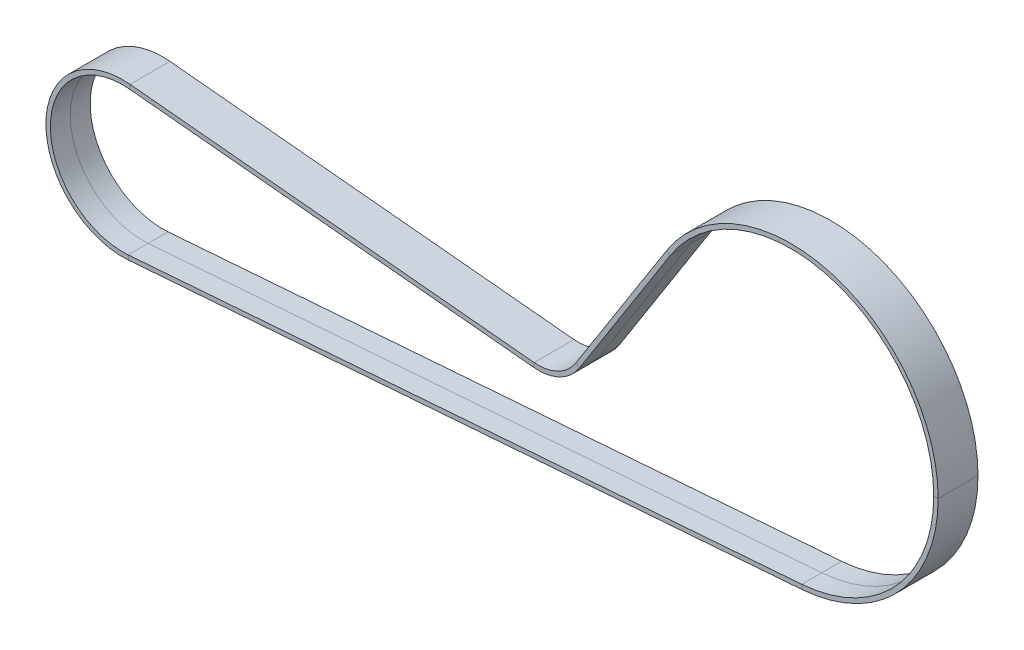
ISO-10303-21;
HEADER;
FILE_DESCRIPTION(('STEP AP214'),'2;1');
FILE_NAME('part.step','',(''),(''),'','','');
FILE_SCHEMA(('AUTOMOTIVE_DESIGN { 1 0 10303 214 1 1 1 1 }'));
ENDSEC;
DATA;
#1=APPLICATION_CONTEXT('core data for automotive mechanical design processes');
#2=APPLICATION_PROTOCOL_DEFINITION('international standard','automotive_design',2000,#1);
#3=PRODUCT_CONTEXT('',#1,'mechanical');
#4=PRODUCT('Part','Part','',(#3));
#5=PRODUCT_RELATED_PRODUCT_CATEGORY('part','',(#4));
#6=PRODUCT_DEFINITION_FORMATION('','',#4);
#7=PRODUCT_DEFINITION_CONTEXT('part definition',#1,'design');
#8=PRODUCT_DEFINITION('design','',#6,#7);
#9=PRODUCT_DEFINITION_SHAPE('','',#8);
#10=(LENGTH_UNIT() NAMED_UNIT(*) SI_UNIT(.MILLI.,.METRE.));
#11=(NAMED_UNIT(*) PLANE_ANGLE_UNIT() SI_UNIT($,.RADIAN.));
#12=(NAMED_UNIT(*) SI_UNIT($,.STERADIAN.) SOLID_ANGLE_UNIT());
#13=UNCERTAINTY_MEASURE_WITH_UNIT(LENGTH_MEASURE(1.E-05),#10,'distance_accuracy_value','');
#14=(GEOMETRIC_REPRESENTATION_CONTEXT(3) GLOBAL_UNCERTAINTY_ASSIGNED_CONTEXT((#13)) GLOBAL_UNIT_ASSIGNED_CONTEXT((#10,
#11,#12)) REPRESENTATION_CONTEXT('',''));
#15=CARTESIAN_POINT('',(0.,0.,0.));
#16=DIRECTION('',(0.,0.,1.));
#17=DIRECTION('',(1.,0.,0.));
#18=AXIS2_PLACEMENT_3D('',#15,#16,#17);
#19=CARTESIAN_POINT('',(0.,0.,0.));
#20=DIRECTION('',(0.,0.,-1.));
#21=DIRECTION('',(-1.,0.,0.));
#22=AXIS2_PLACEMENT_3D('',#19,#20,#21);
#23=CYLINDRICAL_SURFACE('',#22,32.26);
#24=DIRECTION('',(0.,0.,1.));
#25=VECTOR('',#24,1.);
#26=CARTESIAN_POINT('',(-27.2228881365145,17.3095916042759,-4.5));
#27=LINE('',#26,#25);
#28=CARTESIAN_POINT('',(-27.2228881365145,17.3095916042759,-4.5));
#29=VERTEX_POINT('',#28);
#30=CARTESIAN_POINT('',(-27.2228881365145,17.3095916042759,0.));
#31=VERTEX_POINT('',#30);
#32=EDGE_CURVE('E228',#29,#31,#27,.T.);
#33=ORIENTED_EDGE('',*,*,#32,.F.);
#34=CARTESIAN_POINT('',(0.,0.,-4.5));
#35=DIRECTION('',(0.,0.,-1.));
#36=DIRECTION('',(-0.843858900697908,0.536565145823803,0.));
#37=AXIS2_PLACEMENT_3D('',#34,#35,#36);
#38=CIRCLE('',#37,32.26);
#39=CARTESIAN_POINT('',(32.26,0.,-4.5));
#40=VERTEX_POINT('',#39);
#41=EDGE_CURVE('E227',#29,#40,#38,.T.);
#42=ORIENTED_EDGE('',*,*,#41,.T.);
#43=DIRECTION('',(0.,0.,1.));
#44=VECTOR('',#43,1.);
#45=CARTESIAN_POINT('',(32.26,0.,-4.5));
#46=LINE('',#45,#44);
#47=CARTESIAN_POINT('',(32.26,0.,0.));
#48=VERTEX_POINT('',#47);
#49=EDGE_CURVE('E202',#40,#48,#46,.T.);
#50=ORIENTED_EDGE('',*,*,#49,.T.);
#51=CARTESIAN_POINT('',(0.,0.,0.));
#52=DIRECTION('',(0.,0.,-1.));
#53=DIRECTION('',(-0.843858900697908,0.536565145823803,0.));
#54=AXIS2_PLACEMENT_3D('',#51,#52,#53);
#55=CIRCLE('',#54,32.26);
#56=EDGE_CURVE('E232',#31,#48,#55,.T.);
#57=ORIENTED_EDGE('',*,*,#56,.F.);
#58=EDGE_LOOP('',(#33,#42,#50,#57));
#59=FACE_BOUND('',#58,.T.);
#60=ADVANCED_FACE('F33',(#59),#23,.F.);
#61=CARTESIAN_POINT('',(0.,0.,0.));
#62=DIRECTION('',(0.,0.,-1.));
#63=DIRECTION('',(-1.,0.,0.));
#64=AXIS2_PLACEMENT_3D('',#61,#62,#63);
#65=CYLINDRICAL_SURFACE('',#64,32.26);
#66=CARTESIAN_POINT('',(0.,0.,0.));
#67=DIRECTION('',(0.,0.,-1.));
#68=DIRECTION('',(1.,0.,0.));
#69=AXIS2_PLACEMENT_3D('',#66,#67,#68);
#70=CIRCLE('',#69,32.26);
#71=CARTESIAN_POINT('',(2.45978812380377,-32.1660852822657,0.));
#72=VERTEX_POINT('',#71);
#73=EDGE_CURVE('E208',#48,#72,#70,.T.);
#74=ORIENTED_EDGE('',*,*,#73,.F.);
#75=ORIENTED_EDGE('',*,*,#49,.F.);
#76=CARTESIAN_POINT('',(0.,0.,-4.5));
#77=DIRECTION('',(0.,0.,-1.));
#78=DIRECTION('',(1.,0.,0.));
#79=AXIS2_PLACEMENT_3D('',#76,#77,#78);
#80=CIRCLE('',#79,32.26);
#81=CARTESIAN_POINT('',(2.45978812380377,-32.1660852822657,-4.5));
#82=VERTEX_POINT('',#81);
#83=EDGE_CURVE('E206',#40,#82,#80,.T.);
#84=ORIENTED_EDGE('',*,*,#83,.T.);
#85=DIRECTION('',(0.,0.,1.));
#86=VECTOR('',#85,1.);
#87=CARTESIAN_POINT('',(2.45978812380378,-32.1660852822658,-4.5));
#88=LINE('',#87,#86);
#89=EDGE_CURVE('E224',#82,#72,#88,.T.);
#90=ORIENTED_EDGE('',*,*,#89,.T.);
#91=EDGE_LOOP('',(#74,#75,#84,#90));
#92=FACE_BOUND('',#91,.T.);
#93=ADVANCED_FACE('F204',(#92),#65,.F.);
#94=CARTESIAN_POINT('',(0.,0.,0.));
#95=DIRECTION('',(0.,0.,-1.));
#96=DIRECTION('',(-1.,0.,0.));
#97=AXIS2_PLACEMENT_3D('',#94,#95,#96);
#98=CYLINDRICAL_SURFACE('',#97,32.26);
#99=CARTESIAN_POINT('',(0.,0.,4.5));
#100=DIRECTION('',(0.,0.,-1.));
#101=DIRECTION('',(1.,0.,0.));
#102=AXIS2_PLACEMENT_3D('',#99,#100,#101);
#103=CIRCLE('',#102,32.26);
#104=CARTESIAN_POINT('',(32.26,0.,4.5));
#105=VERTEX_POINT('',#104);
#106=CARTESIAN_POINT('',(2.45978812380377,-32.1660852822657,4.5));
#107=VERTEX_POINT('',#106);
#108=EDGE_CURVE('E332',#105,#107,#103,.T.);
#109=ORIENTED_EDGE('',*,*,#108,.F.);
#110=DIRECTION('',(0.,0.,1.));
#111=VECTOR('',#110,1.);
#112=CARTESIAN_POINT('',(32.26,0.,0.));
#113=LINE('',#112,#111);
#114=EDGE_CURVE('E213',#48,#105,#113,.T.);
#115=ORIENTED_EDGE('',*,*,#114,.F.);
#116=ORIENTED_EDGE('',*,*,#73,.T.);
#117=DIRECTION('',(0.,0.,1.));
#118=VECTOR('',#117,1.);
#119=CARTESIAN_POINT('',(2.45978812380378,-32.1660852822658,0.));
#120=LINE('',#119,#118);
#121=EDGE_CURVE('E329',#72,#107,#120,.T.);
#122=ORIENTED_EDGE('',*,*,#121,.T.);
#123=EDGE_LOOP('',(#109,#115,#116,#122));
#124=FACE_BOUND('',#123,.T.);
#125=ADVANCED_FACE('F441',(#124),#98,.F.);
#126=CARTESIAN_POINT('',(32.26,0.,4.5));
#127=DIRECTION('',(0.,0.,-1.));
#128=DIRECTION('',(-1.,0.,0.));
#129=AXIS2_PLACEMENT_3D('',#126,#127,#128);
#130=PLANE('',#129);
#131=CARTESIAN_POINT('',(0.,0.,4.5));
#132=DIRECTION('',(0.,0.,-1.));
#133=DIRECTION('',(1.,0.,0.));
#134=AXIS2_PLACEMENT_3D('',#131,#132,#133);
#135=CIRCLE('',#134,33.26);
#136=CARTESIAN_POINT('',(33.26,0.,4.5));
#137=VERTEX_POINT('',#136);
#138=CARTESIAN_POINT('',(2.53603698071028,-33.1631741006869,4.5));
#139=VERTEX_POINT('',#138);
#140=EDGE_CURVE('E280',#137,#139,#135,.T.);
#141=ORIENTED_EDGE('',*,*,#140,.F.);
#142=DIRECTION('',(1.,0.,0.));
#143=VECTOR('',#142,1.);
#144=CARTESIAN_POINT('',(32.26,0.,4.5));
#145=LINE('',#144,#143);
#146=EDGE_CURVE('E238',#105,#137,#145,.T.);
#147=ORIENTED_EDGE('',*,*,#146,.F.);
#148=ORIENTED_EDGE('',*,*,#108,.T.);
#149=DIRECTION('',(0.0762488569065027,-0.997088818421133,0.));
#150=VECTOR('',#149,1.);
#151=CARTESIAN_POINT('',(2.45978812380378,-32.1660852822658,4.5));
#152=LINE('',#151,#150);
#153=EDGE_CURVE('E334',#107,#139,#152,.T.);
#154=ORIENTED_EDGE('',*,*,#153,.T.);
#155=EDGE_LOOP('',(#141,#147,#148,#154));
#156=FACE_BOUND('',#155,.T.);
#157=ADVANCED_FACE('F389',(#156),#130,.F.);
#158=CARTESIAN_POINT('',(0.,0.,0.));
#159=DIRECTION('',(0.,0.,-1.));
#160=DIRECTION('',(-1.,0.,0.));
#161=AXIS2_PLACEMENT_3D('',#158,#159,#160);
#162=CYLINDRICAL_SURFACE('',#161,33.26);
#163=CARTESIAN_POINT('',(0.,0.,-4.5));
#164=DIRECTION('',(0.,0.,-1.));
#165=DIRECTION('',(1.,0.,0.));
#166=AXIS2_PLACEMENT_3D('',#163,#164,#165);
#167=CIRCLE('',#166,33.26);
#168=CARTESIAN_POINT('',(33.26,0.,-4.5));
#169=VERTEX_POINT('',#168);
#170=CARTESIAN_POINT('',(2.53603698071028,-33.1631741006869,-4.5));
#171=VERTEX_POINT('',#170);
#172=EDGE_CURVE('E244',#169,#171,#167,.T.);
#173=ORIENTED_EDGE('',*,*,#172,.F.);
#174=DIRECTION('',(0.,0.,-1.));
#175=VECTOR('',#174,1.);
#176=CARTESIAN_POINT('',(33.26,0.,4.5));
#177=LINE('',#176,#175);
#178=EDGE_CURVE('E235',#137,#169,#177,.T.);
#179=ORIENTED_EDGE('',*,*,#178,.F.);
#180=ORIENTED_EDGE('',*,*,#140,.T.);
#181=DIRECTION('',(0.,0.,-1.));
#182=VECTOR('',#181,1.);
#183=CARTESIAN_POINT('',(2.53603698071028,-33.1631741006869,4.5));
#184=LINE('',#183,#182);
#185=EDGE_CURVE('E283',#139,#171,#184,.T.);
#186=ORIENTED_EDGE('',*,*,#185,.T.);
#187=EDGE_LOOP('',(#173,#179,#180,#186));
#188=FACE_BOUND('',#187,.T.);
#189=ADVANCED_FACE('F278',(#188),#162,.T.);
#190=CARTESIAN_POINT('',(33.26,0.,-4.5));
#191=DIRECTION('',(0.,0.,1.));
#192=DIRECTION('',(1.,0.,0.));
#193=AXIS2_PLACEMENT_3D('',#190,#191,#192);
#194=PLANE('',#193);
#195=DIRECTION('',(-0.0762488569065027,0.997088818421133,0.));
#196=VECTOR('',#195,1.);
#197=CARTESIAN_POINT('',(2.53603698071028,-33.1631741006869,-4.5));
#198=LINE('',#197,#196);
#199=EDGE_CURVE('E222',#171,#82,#198,.T.);
#200=ORIENTED_EDGE('',*,*,#199,.T.);
#201=ORIENTED_EDGE('',*,*,#83,.F.);
#202=DIRECTION('',(-1.,0.,0.));
#203=VECTOR('',#202,1.);
#204=CARTESIAN_POINT('',(33.26,0.,-4.5));
#205=LINE('',#204,#203);
#206=EDGE_CURVE('E220',#169,#40,#205,.T.);
#207=ORIENTED_EDGE('',*,*,#206,.F.);
#208=ORIENTED_EDGE('',*,*,#172,.T.);
#209=EDGE_LOOP('',(#200,#201,#207,#208));
#210=FACE_BOUND('',#209,.T.);
#211=ADVANCED_FACE('F218',(#210),#194,.F.);
#212=CARTESIAN_POINT('',(2.45978812380377,-32.1660852822658,-4.5));
#213=DIRECTION('',(0.0762488569065017,-0.997088818421133,0.));
#214=DIRECTION('',(0.997088818421134,0.0762488569065017,0.));
#215=AXIS2_PLACEMENT_3D('',#212,#213,#214);
#216=PLANE('',#215);
#217=DIRECTION('',(-0.997088818421133,-0.0762488569065017,0.));
#218=VECTOR('',#217,1.);
#219=CARTESIAN_POINT('',(2.45978812380377,-32.1660852822658,0.));
#220=LINE('',#219,#218);
#221=CARTESIAN_POINT('',(-149.640466325648,-43.7974167370935,0.));
#222=VERTEX_POINT('',#221);
#223=EDGE_CURVE('E339',#72,#222,#220,.T.);
#224=ORIENTED_EDGE('',*,*,#223,.F.);
#225=ORIENTED_EDGE('',*,*,#89,.F.);
#226=DIRECTION('',(-0.997088818421133,-0.0762488569065017,0.));
#227=VECTOR('',#226,1.);
#228=CARTESIAN_POINT('',(2.45978812380377,-32.1660852822658,-4.5));
#229=LINE('',#228,#227);
#230=CARTESIAN_POINT('',(-149.640466325648,-43.7974167370935,-4.5));
#231=VERTEX_POINT('',#230);
#232=EDGE_CURVE('E243',#82,#231,#229,.T.);
#233=ORIENTED_EDGE('',*,*,#232,.T.);
#234=DIRECTION('',(0.,0.,1.));
#235=VECTOR('',#234,1.);
#236=CARTESIAN_POINT('',(-149.640466325648,-43.7974167370934,-4.5));
#237=LINE('',#236,#235);
#238=EDGE_CURVE('E406',#231,#222,#237,.T.);
#239=ORIENTED_EDGE('',*,*,#238,.T.);
#240=EDGE_LOOP('',(#224,#225,#233,#239));
#241=FACE_BOUND('',#240,.T.);
#242=ADVANCED_FACE('F436',(#241),#216,.F.);
#243=CARTESIAN_POINT('',(2.45978812380377,-32.1660852822658,0.));
#244=DIRECTION('',(0.0762488569065017,-0.997088818421133,0.));
#245=DIRECTION('',(0.997088818421134,0.0762488569065017,0.));
#246=AXIS2_PLACEMENT_3D('',#243,#244,#245);
#247=PLANE('',#246);
#248=DIRECTION('',(-0.997088818421133,-0.0762488569065017,0.));
#249=VECTOR('',#248,1.);
#250=CARTESIAN_POINT('',(2.45978812380377,-32.1660852822658,4.5));
#251=LINE('',#250,#249);
#252=CARTESIAN_POINT('',(-149.640466325648,-43.7974167370935,4.5));
#253=VERTEX_POINT('',#252);
#254=EDGE_CURVE('E338',#107,#253,#251,.T.);
#255=ORIENTED_EDGE('',*,*,#254,.F.);
#256=ORIENTED_EDGE('',*,*,#121,.F.);
#257=ORIENTED_EDGE('',*,*,#223,.T.);
#258=DIRECTION('',(0.,0.,1.));
#259=VECTOR('',#258,1.);
#260=CARTESIAN_POINT('',(-149.640466325648,-43.7974167370934,0.));
#261=LINE('',#260,#259);
#262=EDGE_CURVE('E335',#222,#253,#261,.T.);
#263=ORIENTED_EDGE('',*,*,#262,.T.);
#264=EDGE_LOOP('',(#255,#256,#257,#263));
#265=FACE_BOUND('',#264,.T.);
#266=ADVANCED_FACE('F440',(#265),#247,.F.);
#267=CARTESIAN_POINT('',(2.45978812380377,-32.1660852822658,4.5));
#268=DIRECTION('',(0.,0.,-1.));
#269=DIRECTION('',(-1.,0.,0.));
#270=AXIS2_PLACEMENT_3D('',#267,#268,#269);
#271=PLANE('',#270);
#272=DIRECTION('',(-0.997088818421133,-0.0762488569065017,0.));
#273=VECTOR('',#272,1.);
#274=CARTESIAN_POINT('',(2.53603698071027,-33.1631741006869,4.5));
#275=LINE('',#274,#273);
#276=CARTESIAN_POINT('',(-149.564217468741,-44.7945055555146,4.5));
#277=VERTEX_POINT('',#276);
#278=EDGE_CURVE('E291',#139,#277,#275,.T.);
#279=ORIENTED_EDGE('',*,*,#278,.F.);
#280=ORIENTED_EDGE('',*,*,#153,.F.);
#281=ORIENTED_EDGE('',*,*,#254,.T.);
#282=DIRECTION('',(0.0762488569065024,-0.997088818421133,0.));
#283=VECTOR('',#282,1.);
#284=CARTESIAN_POINT('',(-149.640466325648,-43.7974167370934,4.5));
#285=LINE('',#284,#283);
#286=EDGE_CURVE('E341',#253,#277,#285,.T.);
#287=ORIENTED_EDGE('',*,*,#286,.T.);
#288=EDGE_LOOP('',(#279,#280,#281,#287));
#289=FACE_BOUND('',#288,.T.);
#290=ADVANCED_FACE('F393',(#289),#271,.F.);
#291=CARTESIAN_POINT('',(2.53603698071027,-33.1631741006869,4.5));
#292=DIRECTION('',(-0.0762488569065017,0.997088818421133,0.));
#293=DIRECTION('',(-0.997088818421134,-0.0762488569065017,0.));
#294=AXIS2_PLACEMENT_3D('',#291,#292,#293);
#295=PLANE('',#294);
#296=DIRECTION('',(-0.997088818421133,-0.0762488569065017,0.));
#297=VECTOR('',#296,1.);
#298=CARTESIAN_POINT('',(2.53603698071027,-33.1631741006869,-4.5));
#299=LINE('',#298,#297);
#300=CARTESIAN_POINT('',(-149.564217468741,-44.7945055555146,-4.5));
#301=VERTEX_POINT('',#300);
#302=EDGE_CURVE('E249',#171,#301,#299,.T.);
#303=ORIENTED_EDGE('',*,*,#302,.F.);
#304=ORIENTED_EDGE('',*,*,#185,.F.);
#305=ORIENTED_EDGE('',*,*,#278,.T.);
#306=DIRECTION('',(0.,0.,-1.));
#307=VECTOR('',#306,1.);
#308=CARTESIAN_POINT('',(-149.564217468741,-44.7945055555146,4.5));
#309=LINE('',#308,#307);
#310=EDGE_CURVE('E288',#277,#301,#309,.T.);
#311=ORIENTED_EDGE('',*,*,#310,.T.);
#312=EDGE_LOOP('',(#303,#304,#305,#311));
#313=FACE_BOUND('',#312,.T.);
#314=ADVANCED_FACE('F396',(#313),#295,.F.);
#315=CARTESIAN_POINT('',(2.53603698071027,-33.1631741006869,-4.5));
#316=DIRECTION('',(0.,0.,1.));
#317=DIRECTION('',(1.,0.,0.));
#318=AXIS2_PLACEMENT_3D('',#315,#316,#317);
#319=PLANE('',#318);
#320=DIRECTION('',(-0.0762488569065024,0.997088818421133,0.));
#321=VECTOR('',#320,1.);
#322=CARTESIAN_POINT('',(-149.564217468741,-44.7945055555146,-4.5));
#323=LINE('',#322,#321);
#324=EDGE_CURVE('E245',#301,#231,#323,.T.);
#325=ORIENTED_EDGE('',*,*,#324,.T.);
#326=ORIENTED_EDGE('',*,*,#232,.F.);
#327=ORIENTED_EDGE('',*,*,#199,.F.);
#328=ORIENTED_EDGE('',*,*,#302,.T.);
#329=EDGE_LOOP('',(#325,#326,#327,#328));
#330=FACE_BOUND('',#329,.T.);
#331=ADVANCED_FACE('F400',(#330),#319,.F.);
#332=CARTESIAN_POINT('',(-150.886753891785,-27.5,0.));
#333=DIRECTION('',(0.,0.,-1.));
#334=DIRECTION('',(-1.,0.,0.));
#335=AXIS2_PLACEMENT_3D('',#332,#333,#334);
#336=CYLINDRICAL_SURFACE('',#335,16.345);
#337=CARTESIAN_POINT('',(-150.886753891785,-27.5,0.));
#338=DIRECTION('',(0.,0.,-1.));
#339=DIRECTION('',(0.0762488569065013,-0.997088818421133,0.));
#340=AXIS2_PLACEMENT_3D('',#337,#338,#339);
#341=CIRCLE('',#340,16.345);
#342=CARTESIAN_POINT('',(-149.320184824414,-11.2302462723876,0.));
#343=VERTEX_POINT('',#342);
#344=EDGE_CURVE('E183',#222,#343,#341,.T.);
#345=ORIENTED_EDGE('',*,*,#344,.F.);
#346=ORIENTED_EDGE('',*,*,#238,.F.);
#347=CARTESIAN_POINT('',(-150.886753891785,-27.5,-4.5));
#348=DIRECTION('',(0.,0.,-1.));
#349=DIRECTION('',(0.0762488569065013,-0.997088818421133,0.));
#350=AXIS2_PLACEMENT_3D('',#347,#348,#349);
#351=CIRCLE('',#350,16.345);
#352=CARTESIAN_POINT('',(-149.320184824414,-11.2302462723876,-4.5));
#353=VERTEX_POINT('',#352);
#354=EDGE_CURVE('E248',#231,#353,#351,.T.);
#355=ORIENTED_EDGE('',*,*,#354,.T.);
#356=DIRECTION('',(0.,0.,1.));
#357=VECTOR('',#356,1.);
#358=CARTESIAN_POINT('',(-149.320184824414,-11.2302462723876,-4.5));
#359=LINE('',#358,#357);
#360=EDGE_CURVE('E298',#353,#343,#359,.T.);
#361=ORIENTED_EDGE('',*,*,#360,.T.);
#362=EDGE_LOOP('',(#345,#346,#355,#361));
#363=FACE_BOUND('',#362,.T.);
#364=ADVANCED_FACE('F434',(#363),#336,.F.);
#365=CARTESIAN_POINT('',(-150.886753891785,-27.5,0.));
#366=DIRECTION('',(0.,0.,-1.));
#367=DIRECTION('',(-1.,0.,0.));
#368=AXIS2_PLACEMENT_3D('',#365,#366,#367);
#369=CYLINDRICAL_SURFACE('',#368,16.345);
#370=CARTESIAN_POINT('',(-150.886753891785,-27.5,4.5));
#371=DIRECTION('',(0.,0.,-1.));
#372=DIRECTION('',(0.0762488569065013,-0.997088818421133,0.));
#373=AXIS2_PLACEMENT_3D('',#370,#371,#372);
#374=CIRCLE('',#373,16.345);
#375=CARTESIAN_POINT('',(-149.320184824414,-11.2302462723876,4.5));
#376=VERTEX_POINT('',#375);
#377=EDGE_CURVE('E177',#253,#376,#374,.T.);
#378=ORIENTED_EDGE('',*,*,#377,.F.);
#379=ORIENTED_EDGE('',*,*,#262,.F.);
#380=ORIENTED_EDGE('',*,*,#344,.T.);
#381=DIRECTION('',(0.,0.,1.));
#382=VECTOR('',#381,1.);
#383=CARTESIAN_POINT('',(-149.320184824414,-11.2302462723876,0.));
#384=LINE('',#383,#382);
#385=EDGE_CURVE('E342',#343,#376,#384,.T.);
#386=ORIENTED_EDGE('',*,*,#385,.T.);
#387=EDGE_LOOP('',(#378,#379,#380,#386));
#388=FACE_BOUND('',#387,.T.);
#389=ADVANCED_FACE('F469',(#388),#369,.F.);
#390=CARTESIAN_POINT('',(-149.640466325648,-43.7974167370934,4.5));
#391=DIRECTION('',(0.,0.,-1.));
#392=DIRECTION('',(-1.,0.,0.));
#393=AXIS2_PLACEMENT_3D('',#390,#391,#392);
#394=PLANE('',#393);
#395=CARTESIAN_POINT('',(-150.886753891785,-27.5,4.5));
#396=DIRECTION('',(0.,0.,-1.));
#397=DIRECTION('',(0.0762488569065007,-0.997088818421133,0.));
#398=AXIS2_PLACEMENT_3D('',#395,#396,#397);
#399=CIRCLE('',#398,17.345);
#400=CARTESIAN_POINT('',(-149.224340892486,-10.2348498987191,4.5));
#401=VERTEX_POINT('',#400);
#402=EDGE_CURVE('E299',#277,#401,#399,.T.);
#403=ORIENTED_EDGE('',*,*,#402,.F.);
#404=ORIENTED_EDGE('',*,*,#286,.F.);
#405=ORIENTED_EDGE('',*,*,#377,.T.);
#406=DIRECTION('',(0.0958439319284289,0.995396373668549,0.));
#407=VECTOR('',#406,1.);
#408=CARTESIAN_POINT('',(-149.320184824414,-11.2302462723876,4.5));
#409=LINE('',#408,#407);
#410=EDGE_CURVE('E295',#376,#401,#409,.T.);
#411=ORIENTED_EDGE('',*,*,#410,.T.);
#412=EDGE_LOOP('',(#403,#404,#405,#411));
#413=FACE_BOUND('',#412,.T.);
#414=ADVANCED_FACE('F428',(#413),#394,.F.);
#415=CARTESIAN_POINT('',(-150.886753891785,-27.5,0.));
#416=DIRECTION('',(0.,0.,-1.));
#417=DIRECTION('',(-1.,0.,0.));
#418=AXIS2_PLACEMENT_3D('',#415,#416,#417);
#419=CYLINDRICAL_SURFACE('',#418,17.345);
#420=CARTESIAN_POINT('',(-150.886753891785,-27.5,-4.5));
#421=DIRECTION('',(0.,0.,-1.));
#422=DIRECTION('',(0.0762488569065007,-0.997088818421133,0.));
#423=AXIS2_PLACEMENT_3D('',#420,#421,#422);
#424=CIRCLE('',#423,17.345);
#425=CARTESIAN_POINT('',(-149.224340892486,-10.2348498987191,-4.5));
#426=VERTEX_POINT('',#425);
#427=EDGE_CURVE('E296',#301,#426,#424,.T.);
#428=ORIENTED_EDGE('',*,*,#427,.F.);
#429=ORIENTED_EDGE('',*,*,#310,.F.);
#430=ORIENTED_EDGE('',*,*,#402,.T.);
#431=DIRECTION('',(0.,0.,-1.));
#432=VECTOR('',#431,1.);
#433=CARTESIAN_POINT('',(-149.224340892486,-10.2348498987191,4.5));
#434=LINE('',#433,#432);
#435=EDGE_CURVE('E254',#401,#426,#434,.T.);
#436=ORIENTED_EDGE('',*,*,#435,.T.);
#437=EDGE_LOOP('',(#428,#429,#430,#436));
#438=FACE_BOUND('',#437,.T.);
#439=ADVANCED_FACE('F430',(#438),#419,.T.);
#440=CARTESIAN_POINT('',(-149.564217468741,-44.7945055555146,-4.5));
#441=DIRECTION('',(0.,0.,1.));
#442=DIRECTION('',(1.,0.,0.));
#443=AXIS2_PLACEMENT_3D('',#440,#441,#442);
#444=PLANE('',#443);
#445=DIRECTION('',(-0.0958439319284289,-0.995396373668549,0.));
#446=VECTOR('',#445,1.);
#447=CARTESIAN_POINT('',(-149.224340892486,-10.2348498987191,-4.5));
#448=LINE('',#447,#446);
#449=EDGE_CURVE('E250',#426,#353,#448,.T.);
#450=ORIENTED_EDGE('',*,*,#449,.T.);
#451=ORIENTED_EDGE('',*,*,#354,.F.);
#452=ORIENTED_EDGE('',*,*,#324,.F.);
#453=ORIENTED_EDGE('',*,*,#427,.T.);
#454=EDGE_LOOP('',(#450,#451,#452,#453));
#455=FACE_BOUND('',#454,.T.);
#456=ADVANCED_FACE('F432',(#455),#444,.F.);
#457=CARTESIAN_POINT('',(-149.320184824414,-11.2302462723876,-4.5));
#458=DIRECTION('',(0.0958439319284303,0.995396373668549,0.));
#459=DIRECTION('',(-0.995396373668549,0.0958439319284303,0.));
#460=AXIS2_PLACEMENT_3D('',#457,#458,#459);
#461=PLANE('',#460);
#462=DIRECTION('',(0.995396373668549,-0.0958439319284303,0.));
#463=VECTOR('',#462,1.);
#464=CARTESIAN_POINT('',(-149.320184824414,-11.2302462723876,0.));
#465=LINE('',#464,#463);
#466=CARTESIAN_POINT('',(-58.0832612574512,-20.0151943825394,0.));
#467=VERTEX_POINT('',#466);
#468=EDGE_CURVE('E153',#343,#467,#465,.T.);
#469=ORIENTED_EDGE('',*,*,#468,.F.);
#470=ORIENTED_EDGE('',*,*,#360,.F.);
#471=DIRECTION('',(0.995396373668549,-0.0958439319284303,0.));
#472=VECTOR('',#471,1.);
#473=CARTESIAN_POINT('',(-149.320184824414,-11.2302462723876,-4.5));
#474=LINE('',#473,#472);
#475=CARTESIAN_POINT('',(-58.0832612574512,-20.0151943825394,-4.5));
#476=VERTEX_POINT('',#475);
#477=EDGE_CURVE('E253',#353,#476,#474,.T.);
#478=ORIENTED_EDGE('',*,*,#477,.T.);
#479=DIRECTION('',(0.,0.,1.));
#480=VECTOR('',#479,1.);
#481=CARTESIAN_POINT('',(-58.0832612574512,-20.0151943825394,-4.5));
#482=LINE('',#481,#480);
#483=EDGE_CURVE('E414',#476,#467,#482,.T.);
#484=ORIENTED_EDGE('',*,*,#483,.T.);
#485=EDGE_LOOP('',(#469,#470,#478,#484));
#486=FACE_BOUND('',#485,.T.);
#487=ADVANCED_FACE('F419',(#486),#461,.F.);
#488=CARTESIAN_POINT('',(-149.320184824414,-11.2302462723876,0.));
#489=DIRECTION('',(0.0958439319284303,0.995396373668549,0.));
#490=DIRECTION('',(-0.995396373668549,0.0958439319284303,0.));
#491=AXIS2_PLACEMENT_3D('',#488,#489,#490);
#492=PLANE('',#491);
#493=DIRECTION('',(0.995396373668549,-0.0958439319284303,0.));
#494=VECTOR('',#493,1.);
#495=CARTESIAN_POINT('',(-149.320184824414,-11.2302462723876,4.5));
#496=LINE('',#495,#494);
#497=CARTESIAN_POINT('',(-58.0832612574512,-20.0151943825394,4.5));
#498=VERTEX_POINT('',#497);
#499=EDGE_CURVE('E146',#376,#498,#496,.T.);
#500=ORIENTED_EDGE('',*,*,#499,.F.);
#501=ORIENTED_EDGE('',*,*,#385,.F.);
#502=ORIENTED_EDGE('',*,*,#468,.T.);
#503=DIRECTION('',(0.,0.,1.));
#504=VECTOR('',#503,1.);
#505=CARTESIAN_POINT('',(-58.0832612574512,-20.0151943825394,0.));
#506=LINE('',#505,#504);
#507=EDGE_CURVE('E345',#467,#498,#506,.T.);
#508=ORIENTED_EDGE('',*,*,#507,.T.);
#509=EDGE_LOOP('',(#500,#501,#502,#508));
#510=FACE_BOUND('',#509,.T.);
#511=ADVANCED_FACE('F426',(#510),#492,.F.);
#512=CARTESIAN_POINT('',(-149.320184824414,-11.2302462723876,4.5));
#513=DIRECTION('',(0.,0.,-1.));
#514=DIRECTION('',(-1.,0.,0.));
#515=AXIS2_PLACEMENT_3D('',#512,#513,#514);
#516=PLANE('',#515);
#517=DIRECTION('',(0.995396373668549,-0.0958439319284303,0.));
#518=VECTOR('',#517,1.);
#519=CARTESIAN_POINT('',(-149.224340892486,-10.2348498987191,4.5));
#520=LINE('',#519,#518);
#521=CARTESIAN_POINT('',(-57.9874173255228,-19.0197980088708,4.5));
#522=VERTEX_POINT('',#521);
#523=EDGE_CURVE('E139',#401,#522,#520,.T.);
#524=ORIENTED_EDGE('',*,*,#523,.F.);
#525=ORIENTED_EDGE('',*,*,#410,.F.);
#526=ORIENTED_EDGE('',*,*,#499,.T.);
#527=DIRECTION('',(0.0958439319284295,0.995396373668549,0.));
#528=VECTOR('',#527,1.);
#529=CARTESIAN_POINT('',(-58.0832612574512,-20.0151943825394,4.5));
#530=LINE('',#529,#528);
#531=EDGE_CURVE('E348',#498,#522,#530,.T.);
#532=ORIENTED_EDGE('',*,*,#531,.T.);
#533=EDGE_LOOP('',(#524,#525,#526,#532));
#534=FACE_BOUND('',#533,.T.);
#535=ADVANCED_FACE('F427',(#534),#516,.F.);
#536=CARTESIAN_POINT('',(-149.224340892486,-10.2348498987191,4.5));
#537=DIRECTION('',(-0.0958439319284303,-0.995396373668549,0.));
#538=DIRECTION('',(0.995396373668549,-0.0958439319284303,0.));
#539=AXIS2_PLACEMENT_3D('',#536,#537,#538);
#540=PLANE('',#539);
#541=DIRECTION('',(0.995396373668549,-0.0958439319284303,0.));
#542=VECTOR('',#541,1.);
#543=CARTESIAN_POINT('',(-149.224340892486,-10.2348498987191,-4.5));
#544=LINE('',#543,#542);
#545=CARTESIAN_POINT('',(-57.9874173255228,-19.0197980088708,-4.5));
#546=VERTEX_POINT('',#545);
#547=EDGE_CURVE('E258',#426,#546,#544,.T.);
#548=ORIENTED_EDGE('',*,*,#547,.F.);
#549=ORIENTED_EDGE('',*,*,#435,.F.);
#550=ORIENTED_EDGE('',*,*,#523,.T.);
#551=DIRECTION('',(0.,0.,-1.));
#552=VECTOR('',#551,1.);
#553=CARTESIAN_POINT('',(-57.9874173255228,-19.0197980088708,4.5));
#554=LINE('',#553,#552);
#555=EDGE_CURVE('E300',#522,#546,#554,.T.);
#556=ORIENTED_EDGE('',*,*,#555,.T.);
#557=EDGE_LOOP('',(#548,#549,#550,#556));
#558=FACE_BOUND('',#557,.T.);
#559=ADVANCED_FACE('F306',(#558),#540,.F.);
#560=CARTESIAN_POINT('',(-149.224340892486,-10.2348498987191,-4.5));
#561=DIRECTION('',(0.,0.,1.));
#562=DIRECTION('',(1.,0.,0.));
#563=AXIS2_PLACEMENT_3D('',#560,#561,#562);
#564=PLANE('',#563);
#565=DIRECTION('',(-0.0958439319284295,-0.995396373668549,0.));
#566=VECTOR('',#565,1.);
#567=CARTESIAN_POINT('',(-57.9874173255228,-19.0197980088708,-4.5));
#568=LINE('',#567,#566);
#569=EDGE_CURVE('E255',#546,#476,#568,.T.);
#570=ORIENTED_EDGE('',*,*,#569,.T.);
#571=ORIENTED_EDGE('',*,*,#477,.F.);
#572=ORIENTED_EDGE('',*,*,#449,.F.);
#573=ORIENTED_EDGE('',*,*,#547,.T.);
#574=EDGE_LOOP('',(#570,#571,#572,#573));
#575=FACE_BOUND('',#574,.T.);
#576=ADVANCED_FACE('F304',(#575),#564,.F.);
#577=CARTESIAN_POINT('',(-57.0289780062385,-9.06583427218531,0.));
#578=DIRECTION('',(0.,0.,1.));
#579=DIRECTION('',(1.,0.,0.));
#580=AXIS2_PLACEMENT_3D('',#577,#578,#579);
#581=CYLINDRICAL_SURFACE('',#580,11.);
#582=CARTESIAN_POINT('',(-57.0289780062385,-9.06583427218531,0.));
#583=DIRECTION('',(0.,0.,1.));
#584=DIRECTION('',(-0.0958439319284302,-0.995396373668549,0.));
#585=AXIS2_PLACEMENT_3D('',#582,#583,#584);
#586=CIRCLE('',#585,11.);
#587=CARTESIAN_POINT('',(-47.7465300985615,-14.9680508762472,0.));
#588=VERTEX_POINT('',#587);
#589=EDGE_CURVE('E315',#467,#588,#586,.T.);
#590=ORIENTED_EDGE('',*,*,#589,.F.);
#591=ORIENTED_EDGE('',*,*,#483,.F.);
#592=CARTESIAN_POINT('',(-57.0289780062385,-9.06583427218531,-4.5));
#593=DIRECTION('',(0.,0.,1.));
#594=DIRECTION('',(-0.0958439319284302,-0.995396373668549,0.));
#595=AXIS2_PLACEMENT_3D('',#592,#593,#594);
#596=CIRCLE('',#595,11.);
#597=CARTESIAN_POINT('',(-47.7465300985615,-14.9680508762472,-4.5));
#598=VERTEX_POINT('',#597);
#599=EDGE_CURVE('E257',#476,#598,#596,.T.);
#600=ORIENTED_EDGE('',*,*,#599,.T.);
#601=DIRECTION('',(0.,0.,1.));
#602=VECTOR('',#601,1.);
#603=CARTESIAN_POINT('',(-47.7465300985615,-14.9680508762472,-4.5));
#604=LINE('',#603,#602);
#605=EDGE_CURVE('E313',#598,#588,#604,.T.);
#606=ORIENTED_EDGE('',*,*,#605,.T.);
#607=EDGE_LOOP('',(#590,#591,#600,#606));
#608=FACE_BOUND('',#607,.T.);
#609=ADVANCED_FACE('F421',(#608),#581,.T.);
#610=CARTESIAN_POINT('',(-57.0289780062385,-9.06583427218531,0.));
#611=DIRECTION('',(0.,0.,1.));
#612=DIRECTION('',(1.,0.,0.));
#613=AXIS2_PLACEMENT_3D('',#610,#611,#612);
#614=CYLINDRICAL_SURFACE('',#613,11.);
#615=CARTESIAN_POINT('',(-57.0289780062385,-9.06583427218531,4.5));
#616=DIRECTION('',(0.,0.,1.));
#617=DIRECTION('',(-0.0958439319284302,-0.995396373668549,0.));
#618=AXIS2_PLACEMENT_3D('',#615,#616,#617);
#619=CIRCLE('',#618,11.);
#620=CARTESIAN_POINT('',(-47.7465300985615,-14.9680508762472,4.5));
#621=VERTEX_POINT('',#620);
#622=EDGE_CURVE('E115',#498,#621,#619,.T.);
#623=ORIENTED_EDGE('',*,*,#622,.F.);
#624=ORIENTED_EDGE('',*,*,#507,.F.);
#625=ORIENTED_EDGE('',*,*,#589,.T.);
#626=DIRECTION('',(0.,0.,1.));
#627=VECTOR('',#626,1.);
#628=CARTESIAN_POINT('',(-47.7465300985615,-14.9680508762472,0.));
#629=LINE('',#628,#627);
#630=EDGE_CURVE('E349',#588,#621,#629,.T.);
#631=ORIENTED_EDGE('',*,*,#630,.T.);
#632=EDGE_LOOP('',(#623,#624,#625,#631));
#633=FACE_BOUND('',#632,.T.);
#634=ADVANCED_FACE('F425',(#633),#614,.T.);
#635=CARTESIAN_POINT('',(-58.0832612574512,-20.0151943825394,4.5));
#636=DIRECTION('',(0.,0.,-1.));
#637=DIRECTION('',(-1.,0.,0.));
#638=AXIS2_PLACEMENT_3D('',#635,#636,#637);
#639=PLANE('',#638);
#640=CARTESIAN_POINT('',(-57.0289780062385,-9.06583427218531,4.5));
#641=DIRECTION('',(0.,0.,1.));
#642=DIRECTION('',(-0.0958439319284304,-0.995396373668549,0.));
#643=AXIS2_PLACEMENT_3D('',#640,#641,#642);
#644=CIRCLE('',#643,10.);
#645=CARTESIAN_POINT('',(-48.5903889992594,-14.4314857304234,4.5));
#646=VERTEX_POINT('',#645);
#647=EDGE_CURVE('E107',#522,#646,#644,.T.);
#648=ORIENTED_EDGE('',*,*,#647,.F.);
#649=ORIENTED_EDGE('',*,*,#531,.F.);
#650=ORIENTED_EDGE('',*,*,#622,.T.);
#651=DIRECTION('',(-0.843858900697907,0.536565145823803,0.));
#652=VECTOR('',#651,1.);
#653=CARTESIAN_POINT('',(-47.7465300985615,-14.9680508762472,4.5));
#654=LINE('',#653,#652);
#655=EDGE_CURVE('E352',#621,#646,#654,.T.);
#656=ORIENTED_EDGE('',*,*,#655,.T.);
#657=EDGE_LOOP('',(#648,#649,#650,#656));
#658=FACE_BOUND('',#657,.T.);
#659=ADVANCED_FACE('F504',(#658),#639,.F.);
#660=CARTESIAN_POINT('',(-57.0289780062385,-9.06583427218531,0.));
#661=DIRECTION('',(0.,0.,1.));
#662=DIRECTION('',(1.,0.,0.));
#663=AXIS2_PLACEMENT_3D('',#660,#661,#662);
#664=CYLINDRICAL_SURFACE('',#663,10.);
#665=CARTESIAN_POINT('',(-57.0289780062385,-9.06583427218531,-4.5));
#666=DIRECTION('',(0.,0.,1.));
#667=DIRECTION('',(-0.0958439319284304,-0.995396373668549,0.));
#668=AXIS2_PLACEMENT_3D('',#665,#666,#667);
#669=CIRCLE('',#668,10.);
#670=CARTESIAN_POINT('',(-48.5903889992594,-14.4314857304234,-4.5));
#671=VERTEX_POINT('',#670);
#672=EDGE_CURVE('E98',#546,#671,#669,.T.);
#673=ORIENTED_EDGE('',*,*,#672,.F.);
#674=ORIENTED_EDGE('',*,*,#555,.F.);
#675=ORIENTED_EDGE('',*,*,#647,.T.);
#676=DIRECTION('',(0.,0.,-1.));
#677=VECTOR('',#676,1.);
#678=CARTESIAN_POINT('',(-48.5903889992594,-14.4314857304234,4.5));
#679=LINE('',#678,#677);
#680=EDGE_CURVE('E264',#646,#671,#679,.T.);
#681=ORIENTED_EDGE('',*,*,#680,.T.);
#682=EDGE_LOOP('',(#673,#674,#675,#681));
#683=FACE_BOUND('',#682,.T.);
#684=ADVANCED_FACE('F307',(#683),#664,.F.);
#685=CARTESIAN_POINT('',(-57.9874173255228,-19.0197980088708,-4.5));
#686=DIRECTION('',(0.,0.,1.));
#687=DIRECTION('',(1.,0.,0.));
#688=AXIS2_PLACEMENT_3D('',#685,#686,#687);
#689=PLANE('',#688);
#690=DIRECTION('',(0.843858900697907,-0.536565145823803,0.));
#691=VECTOR('',#690,1.);
#692=CARTESIAN_POINT('',(-48.5903889992594,-14.4314857304234,-4.5));
#693=LINE('',#692,#691);
#694=EDGE_CURVE('E259',#671,#598,#693,.T.);
#695=ORIENTED_EDGE('',*,*,#694,.T.);
#696=ORIENTED_EDGE('',*,*,#599,.F.);
#697=ORIENTED_EDGE('',*,*,#569,.F.);
#698=ORIENTED_EDGE('',*,*,#672,.T.);
#699=EDGE_LOOP('',(#695,#696,#697,#698));
#700=FACE_BOUND('',#699,.T.);
#701=ADVANCED_FACE('F308',(#700),#689,.F.);
#702=CARTESIAN_POINT('',(-47.7465300985615,-14.9680508762472,-4.5));
#703=DIRECTION('',(-0.843858900697907,0.536565145823804,0.));
#704=DIRECTION('',(-0.536565145823804,-0.843858900697907,0.));
#705=AXIS2_PLACEMENT_3D('',#702,#703,#704);
#706=PLANE('',#705);
#707=DIRECTION('',(0.536565145823804,0.843858900697907,0.));
#708=VECTOR('',#707,1.);
#709=CARTESIAN_POINT('',(-47.7465300985615,-14.9680508762472,0.));
#710=LINE('',#709,#708);
#711=EDGE_CURVE('E320',#588,#31,#710,.T.);
#712=ORIENTED_EDGE('',*,*,#711,.F.);
#713=ORIENTED_EDGE('',*,*,#605,.F.);
#714=DIRECTION('',(0.536565145823804,0.843858900697907,0.));
#715=VECTOR('',#714,1.);
#716=CARTESIAN_POINT('',(-47.7465300985615,-14.9680508762472,-4.5));
#717=LINE('',#716,#715);
#718=EDGE_CURVE('E260',#598,#29,#717,.T.);
#719=ORIENTED_EDGE('',*,*,#718,.T.);
#720=ORIENTED_EDGE('',*,*,#32,.T.);
#721=EDGE_LOOP('',(#712,#713,#719,#720));
#722=FACE_BOUND('',#721,.T.);
#723=ADVANCED_FACE('F458',(#722),#706,.F.);
#724=CARTESIAN_POINT('',(-47.7465300985615,-14.9680508762472,0.));
#725=DIRECTION('',(-0.843858900697907,0.536565145823804,0.));
#726=DIRECTION('',(-0.536565145823804,-0.843858900697907,0.));
#727=AXIS2_PLACEMENT_3D('',#724,#725,#726);
#728=PLANE('',#727);
#729=DIRECTION('',(0.536565145823804,0.843858900697907,0.));
#730=VECTOR('',#729,1.);
#731=CARTESIAN_POINT('',(-47.7465300985615,-14.9680508762472,4.5));
#732=LINE('',#731,#730);
#733=CARTESIAN_POINT('',(-27.2228881365145,17.3095916042759,4.5));
#734=VERTEX_POINT('',#733);
#735=EDGE_CURVE('E355',#621,#734,#732,.T.);
#736=ORIENTED_EDGE('',*,*,#735,.F.);
#737=ORIENTED_EDGE('',*,*,#630,.F.);
#738=ORIENTED_EDGE('',*,*,#711,.T.);
#739=DIRECTION('',(0.,0.,1.));
#740=VECTOR('',#739,1.);
#741=CARTESIAN_POINT('',(-27.2228881365145,17.3095916042759,0.));
#742=LINE('',#741,#740);
#743=EDGE_CURVE('E322',#31,#734,#742,.T.);
#744=ORIENTED_EDGE('',*,*,#743,.T.);
#745=EDGE_LOOP('',(#736,#737,#738,#744));
#746=FACE_BOUND('',#745,.T.);
#747=ADVANCED_FACE('F461',(#746),#728,.F.);
#748=CARTESIAN_POINT('',(-47.7465300985615,-14.9680508762472,4.5));
#749=DIRECTION('',(0.,0.,-1.));
#750=DIRECTION('',(-1.,0.,0.));
#751=AXIS2_PLACEMENT_3D('',#748,#749,#750);
#752=PLANE('',#751);
#753=DIRECTION('',(0.536565145823804,0.843858900697907,0.));
#754=VECTOR('',#753,1.);
#755=CARTESIAN_POINT('',(-48.5903889992594,-14.4314857304234,4.5));
#756=LINE('',#755,#754);
#757=CARTESIAN_POINT('',(-28.0667470372124,17.8461567500997,4.5));
#758=VERTEX_POINT('',#757);
#759=EDGE_CURVE('E58',#646,#758,#756,.T.);
#760=ORIENTED_EDGE('',*,*,#759,.F.);
#761=ORIENTED_EDGE('',*,*,#655,.F.);
#762=ORIENTED_EDGE('',*,*,#735,.T.);
#763=DIRECTION('',(-0.843858900697908,0.536565145823803,0.));
#764=VECTOR('',#763,1.);
#765=CARTESIAN_POINT('',(-27.2228881365145,17.3095916042759,4.5));
#766=LINE('',#765,#764);
#767=EDGE_CURVE('E357',#734,#758,#766,.T.);
#768=ORIENTED_EDGE('',*,*,#767,.T.);
#769=EDGE_LOOP('',(#760,#761,#762,#768));
#770=FACE_BOUND('',#769,.T.);
#771=ADVANCED_FACE('F377',(#770),#752,.F.);
#772=CARTESIAN_POINT('',(-48.5903889992594,-14.4314857304234,4.5));
#773=DIRECTION('',(0.843858900697907,-0.536565145823804,0.));
#774=DIRECTION('',(0.536565145823804,0.843858900697907,0.));
#775=AXIS2_PLACEMENT_3D('',#772,#773,#774);
#776=PLANE('',#775);
#777=DIRECTION('',(0.536565145823804,0.843858900697907,0.));
#778=VECTOR('',#777,1.);
#779=CARTESIAN_POINT('',(-48.5903889992594,-14.4314857304234,-4.5));
#780=LINE('',#779,#778);
#781=CARTESIAN_POINT('',(-28.0667470372124,17.8461567500997,-4.5));
#782=VERTEX_POINT('',#781);
#783=EDGE_CURVE('E50',#671,#782,#780,.T.);
#784=ORIENTED_EDGE('',*,*,#783,.F.);
#785=ORIENTED_EDGE('',*,*,#680,.F.);
#786=ORIENTED_EDGE('',*,*,#759,.T.);
#787=DIRECTION('',(0.,0.,-1.));
#788=VECTOR('',#787,1.);
#789=CARTESIAN_POINT('',(-28.0667470372124,17.8461567500997,4.5));
#790=LINE('',#789,#788);
#791=EDGE_CURVE('E269',#758,#782,#790,.T.);
#792=ORIENTED_EDGE('',*,*,#791,.T.);
#793=EDGE_LOOP('',(#784,#785,#786,#792));
#794=FACE_BOUND('',#793,.T.);
#795=ADVANCED_FACE('F491',(#794),#776,.F.);
#796=CARTESIAN_POINT('',(-48.5903889992594,-14.4314857304234,-4.5));
#797=DIRECTION('',(0.,0.,1.));
#798=DIRECTION('',(1.,0.,0.));
#799=AXIS2_PLACEMENT_3D('',#796,#797,#798);
#800=PLANE('',#799);
#801=DIRECTION('',(0.843858900697908,-0.536565145823803,0.));
#802=VECTOR('',#801,1.);
#803=CARTESIAN_POINT('',(-28.0667470372124,17.8461567500997,-4.5));
#804=LINE('',#803,#802);
#805=EDGE_CURVE('E37',#782,#29,#804,.T.);
#806=ORIENTED_EDGE('',*,*,#805,.T.);
#807=ORIENTED_EDGE('',*,*,#718,.F.);
#808=ORIENTED_EDGE('',*,*,#694,.F.);
#809=ORIENTED_EDGE('',*,*,#783,.T.);
#810=EDGE_LOOP('',(#806,#807,#808,#809));
#811=FACE_BOUND('',#810,.T.);
#812=ADVANCED_FACE('F270',(#811),#800,.F.);
#813=CARTESIAN_POINT('',(0.,0.,0.));
#814=DIRECTION('',(0.,0.,-1.));
#815=DIRECTION('',(-1.,0.,0.));
#816=AXIS2_PLACEMENT_3D('',#813,#814,#815);
#817=CYLINDRICAL_SURFACE('',#816,32.26);
#818=ORIENTED_EDGE('',*,*,#56,.T.);
#819=ORIENTED_EDGE('',*,*,#114,.T.);
#820=CARTESIAN_POINT('',(0.,0.,4.5));
#821=DIRECTION('',(0.,0.,-1.));
#822=DIRECTION('',(-0.843858900697908,0.536565145823803,0.));
#823=AXIS2_PLACEMENT_3D('',#820,#821,#822);
#824=CIRCLE('',#823,32.26);
#825=EDGE_CURVE('E325',#734,#105,#824,.T.);
#826=ORIENTED_EDGE('',*,*,#825,.F.);
#827=ORIENTED_EDGE('',*,*,#743,.F.);
#828=EDGE_LOOP('',(#818,#819,#826,#827));
#829=FACE_BOUND('',#828,.T.);
#830=ADVANCED_FACE('F385',(#829),#817,.F.);
#831=CARTESIAN_POINT('',(-27.2228881365145,17.3095916042759,4.5));
#832=DIRECTION('',(0.,0.,-1.));
#833=DIRECTION('',(-1.,0.,0.));
#834=AXIS2_PLACEMENT_3D('',#831,#832,#833);
#835=PLANE('',#834);
#836=ORIENTED_EDGE('',*,*,#825,.T.);
#837=ORIENTED_EDGE('',*,*,#146,.T.);
#838=CARTESIAN_POINT('',(0.,0.,4.5));
#839=DIRECTION('',(0.,0.,-1.));
#840=DIRECTION('',(-0.843858900697908,0.536565145823803,0.));
#841=AXIS2_PLACEMENT_3D('',#838,#839,#840);
#842=CIRCLE('',#841,33.26);
#843=EDGE_CURVE('E42',#758,#137,#842,.T.);
#844=ORIENTED_EDGE('',*,*,#843,.F.);
#845=ORIENTED_EDGE('',*,*,#767,.F.);
#846=EDGE_LOOP('',(#836,#837,#844,#845));
#847=FACE_BOUND('',#846,.T.);
#848=ADVANCED_FACE('F382',(#847),#835,.F.);
#849=CARTESIAN_POINT('',(0.,0.,0.));
#850=DIRECTION('',(0.,0.,-1.));
#851=DIRECTION('',(-1.,0.,0.));
#852=AXIS2_PLACEMENT_3D('',#849,#850,#851);
#853=CYLINDRICAL_SURFACE('',#852,33.26);
#854=ORIENTED_EDGE('',*,*,#843,.T.);
#855=ORIENTED_EDGE('',*,*,#178,.T.);
#856=CARTESIAN_POINT('',(0.,0.,-4.5));
#857=DIRECTION('',(0.,0.,-1.));
#858=DIRECTION('',(-0.843858900697908,0.536565145823803,0.));
#859=AXIS2_PLACEMENT_3D('',#856,#857,#858);
#860=CIRCLE('',#859,33.26);
#861=EDGE_CURVE('E11',#782,#169,#860,.T.);
#862=ORIENTED_EDGE('',*,*,#861,.F.);
#863=ORIENTED_EDGE('',*,*,#791,.F.);
#864=EDGE_LOOP('',(#854,#855,#862,#863));
#865=FACE_BOUND('',#864,.T.);
#866=ADVANCED_FACE('F274',(#865),#853,.T.);
#867=CARTESIAN_POINT('',(-28.0667470372124,17.8461567500997,-4.5));
#868=DIRECTION('',(0.,0.,1.));
#869=DIRECTION('',(1.,0.,0.));
#870=AXIS2_PLACEMENT_3D('',#867,#868,#869);
#871=PLANE('',#870);
#872=ORIENTED_EDGE('',*,*,#861,.T.);
#873=ORIENTED_EDGE('',*,*,#206,.T.);
#874=ORIENTED_EDGE('',*,*,#41,.F.);
#875=ORIENTED_EDGE('',*,*,#805,.F.);
#876=EDGE_LOOP('',(#872,#873,#874,#875));
#877=FACE_BOUND('',#876,.T.);
#878=ADVANCED_FACE('F35',(#877),#871,.F.);
#879=CLOSED_SHELL('',(#60,#93,#125,#157,#189,#211,#242,#266,#290,#314,#331,#364,#389,#414,#439,
#456,#487,#511,#535,#559,#576,#609,#634,#659,#684,#701,#723,#747,#771,#795,#812,#830,#848,#866,#878));
#880=MANIFOLD_SOLID_BREP('B2',#879);
#881=ADVANCED_BREP_SHAPE_REPRESENTATION('',(#18,#880),#14);
#882=SHAPE_DEFINITION_REPRESENTATION(#9,#881);
ENDSEC;
END-ISO-10303-21;
